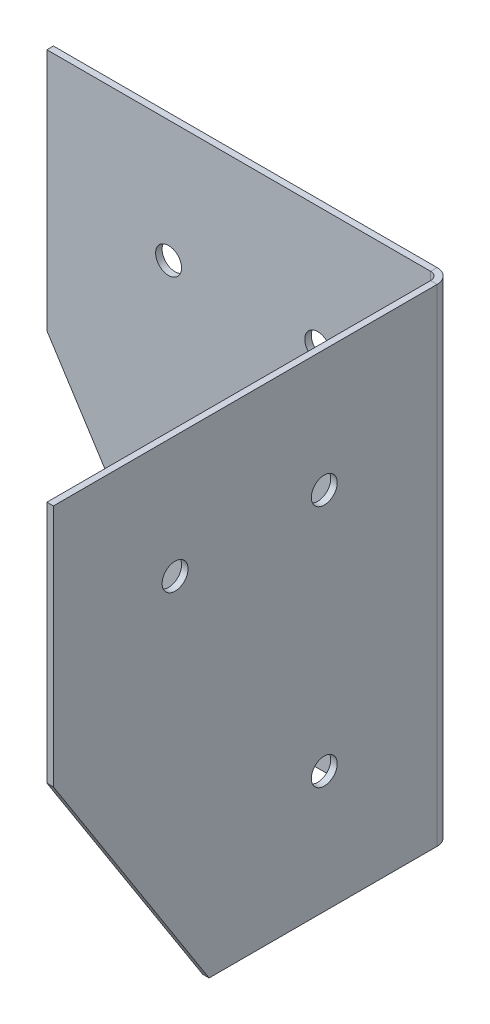
ISO-10303-21;
HEADER;
FILE_DESCRIPTION(('STEP AP214'),'2;1');
FILE_NAME('part.step','',(''),(''),'','','');
FILE_SCHEMA(('AUTOMOTIVE_DESIGN { 1 0 10303 214 1 1 1 1 }'));
ENDSEC;
DATA;
#1=APPLICATION_CONTEXT('core data for automotive mechanical design processes');
#2=APPLICATION_PROTOCOL_DEFINITION('international standard','automotive_design',2000,#1);
#3=PRODUCT_CONTEXT('',#1,'mechanical');
#4=PRODUCT('Part','Part','',(#3));
#5=PRODUCT_RELATED_PRODUCT_CATEGORY('part','',(#4));
#6=PRODUCT_DEFINITION_FORMATION('','',#4);
#7=PRODUCT_DEFINITION_CONTEXT('part definition',#1,'design');
#8=PRODUCT_DEFINITION('design','',#6,#7);
#9=PRODUCT_DEFINITION_SHAPE('','',#8);
#10=(LENGTH_UNIT() NAMED_UNIT(*) SI_UNIT(.MILLI.,.METRE.));
#11=(NAMED_UNIT(*) PLANE_ANGLE_UNIT() SI_UNIT($,.RADIAN.));
#12=(NAMED_UNIT(*) SI_UNIT($,.STERADIAN.) SOLID_ANGLE_UNIT());
#13=UNCERTAINTY_MEASURE_WITH_UNIT(LENGTH_MEASURE(1.E-05),#10,'distance_accuracy_value','');
#14=(GEOMETRIC_REPRESENTATION_CONTEXT(3) GLOBAL_UNCERTAINTY_ASSIGNED_CONTEXT((#13)) GLOBAL_UNIT_ASSIGNED_CONTEXT((#10,
#11,#12)) REPRESENTATION_CONTEXT('',''));
#15=CARTESIAN_POINT('',(0.,0.,0.));
#16=DIRECTION('',(0.,0.,1.));
#17=DIRECTION('',(1.,0.,0.));
#18=AXIS2_PLACEMENT_3D('',#15,#16,#17);
#19=CARTESIAN_POINT('',(-0.0995574287564259,0.,-0.0995574287564274));
#20=DIRECTION('',(1.,0.,0.));
#21=DIRECTION('',(0.,0.,-1.));
#22=AXIS2_PLACEMENT_3D('',#19,#20,#21);
#23=PLANE('',#22);
#24=CARTESIAN_POINT('',(-0.0995574287564783,-13.5,14.9104160059651));
#25=DIRECTION('',(-1.,0.,0.));
#26=DIRECTION('',(0.,0.,-1.));
#27=AXIS2_PLACEMENT_3D('',#24,#25,#26);
#28=CIRCLE('',#27,1.6);
#29=CARTESIAN_POINT('',(-0.0995574287564727,-13.5,13.3104160059651));
#30=VERTEX_POINT('',#29);
#31=EDGE_CURVE('E204',#30,#30,#28,.T.);
#32=ORIENTED_EDGE('',*,*,#31,.F.);
#33=EDGE_LOOP('',(#32));
#34=FACE_BOUND('',#33,.T.);
#35=CARTESIAN_POINT('',(-0.0995574287564783,16.5,14.9104160059651));
#36=DIRECTION('',(-1.,0.,0.));
#37=DIRECTION('',(0.,0.,-1.));
#38=AXIS2_PLACEMENT_3D('',#35,#36,#37);
#39=CIRCLE('',#38,1.6);
#40=CARTESIAN_POINT('',(-0.0995574287564727,16.5,13.3104160059651));
#41=VERTEX_POINT('',#40);
#42=EDGE_CURVE('E196',#41,#41,#39,.T.);
#43=ORIENTED_EDGE('',*,*,#42,.F.);
#44=EDGE_LOOP('',(#43));
#45=FACE_BOUND('',#44,.T.);
#46=CARTESIAN_POINT('',(-0.0995574287565425,16.5,33.3004425712436));
#47=DIRECTION('',(-1.,0.,0.));
#48=DIRECTION('',(0.,0.,-1.));
#49=AXIS2_PLACEMENT_3D('',#46,#47,#48);
#50=CIRCLE('',#49,1.6);
#51=CARTESIAN_POINT('',(-0.0995574287565369,16.5,31.7004425712436));
#52=VERTEX_POINT('',#51);
#53=EDGE_CURVE('E197',#52,#52,#50,.T.);
#54=ORIENTED_EDGE('',*,*,#53,.F.);
#55=EDGE_LOOP('',(#54));
#56=FACE_BOUND('',#55,.T.);
#57=DIRECTION('',(0.,0.,-1.));
#58=VECTOR('',#57,1.);
#59=CARTESIAN_POINT('',(-0.0995574287562569,31.5,-48.4995574287564));
#60=LINE('',#59,#58);
#61=CARTESIAN_POINT('',(-0.0995574287565949,31.5,48.3004425712436));
#62=VERTEX_POINT('',#61);
#63=CARTESIAN_POINT('',(-0.0995574287564297,31.5,1.));
#64=VERTEX_POINT('',#63);
#65=EDGE_CURVE('E63',#62,#64,#60,.T.);
#66=ORIENTED_EDGE('',*,*,#65,.T.);
#67=DIRECTION('',(0.,-1.,0.));
#68=VECTOR('',#67,1.);
#69=CARTESIAN_POINT('',(-0.0995574287564297,0.,1.));
#70=LINE('',#69,#68);
#71=CARTESIAN_POINT('',(-0.0995574287564297,-28.5,1.));
#72=VERTEX_POINT('',#71);
#73=EDGE_CURVE('E55',#64,#72,#70,.T.);
#74=ORIENTED_EDGE('',*,*,#73,.T.);
#75=DIRECTION('',(0.,0.,1.));
#76=VECTOR('',#75,1.);
#77=CARTESIAN_POINT('',(-0.0995574287565278,-28.5,29.1004425712436));
#78=LINE('',#77,#76);
#79=CARTESIAN_POINT('',(-0.0995574287565278,-28.5,29.1004425712436));
#80=VERTEX_POINT('',#79);
#81=EDGE_CURVE('E71',#72,#80,#78,.T.);
#82=ORIENTED_EDGE('',*,*,#81,.T.);
#83=DIRECTION('',(0.,0.842271400661511,0.539053696423368));
#84=VECTOR('',#83,1.);
#85=CARTESIAN_POINT('',(-0.0995574287565278,-28.5,29.1004425712436));
#86=LINE('',#85,#84);
#87=CARTESIAN_POINT('',(-0.0995574287565949,1.49999999999999,48.3004425712436));
#88=VERTEX_POINT('',#87);
#89=EDGE_CURVE('E219',#80,#88,#86,.T.);
#90=ORIENTED_EDGE('',*,*,#89,.T.);
#91=DIRECTION('',(0.,1.,0.));
#92=VECTOR('',#91,1.);
#93=CARTESIAN_POINT('',(-0.0995574287565949,1.49999999999999,48.3004425712436));
#94=LINE('',#93,#92);
#95=EDGE_CURVE('E222',#88,#62,#94,.T.);
#96=ORIENTED_EDGE('',*,*,#95,.T.);
#97=EDGE_LOOP('',(#66,#74,#82,#90,#96));
#98=FACE_BOUND('',#97,.T.);
#99=ADVANCED_FACE('F46',(#34,#45,#56,#98),#23,.F.);
#100=CARTESIAN_POINT('',(0.700442571243743,31.5,-48.4995574287564));
#101=DIRECTION('',(0.,1.,0.));
#102=DIRECTION('',(-1.,0.,0.));
#103=AXIS2_PLACEMENT_3D('',#100,#101,#102);
#104=PLANE('',#103);
#105=DIRECTION('',(1.,0.,0.));
#106=VECTOR('',#105,1.);
#107=CARTESIAN_POINT('',(0.70044257124357,31.5,1.));
#108=LINE('',#107,#106);
#109=CARTESIAN_POINT('',(0.70044257124357,31.5,1.));
#110=VERTEX_POINT('',#109);
#111=EDGE_CURVE('E12',#64,#110,#108,.T.);
#112=ORIENTED_EDGE('',*,*,#111,.F.);
#113=ORIENTED_EDGE('',*,*,#65,.F.);
#114=DIRECTION('',(-1.,0.,0.));
#115=VECTOR('',#114,1.);
#116=CARTESIAN_POINT('',(0.700442571243405,31.5,48.3004425712436));
#117=LINE('',#116,#115);
#118=CARTESIAN_POINT('',(0.700442571243405,31.5,48.3004425712436));
#119=VERTEX_POINT('',#118);
#120=EDGE_CURVE('E224',#119,#62,#117,.T.);
#121=ORIENTED_EDGE('',*,*,#120,.F.);
#122=DIRECTION('',(0.,0.,-1.));
#123=VECTOR('',#122,1.);
#124=CARTESIAN_POINT('',(0.700442571243743,31.5,-48.4995574287564));
#125=LINE('',#124,#123);
#126=EDGE_CURVE('E218',#119,#110,#125,.T.);
#127=ORIENTED_EDGE('',*,*,#126,.T.);
#128=EDGE_LOOP('',(#112,#113,#121,#127));
#129=FACE_BOUND('',#128,.T.);
#130=ADVANCED_FACE('F48',(#129),#104,.T.);
#131=CARTESIAN_POINT('',(0.700442571243405,1.49999999999999,48.3004425712436));
#132=DIRECTION('',(0.,0.,1.));
#133=DIRECTION('',(1.,0.,0.));
#134=AXIS2_PLACEMENT_3D('',#131,#132,#133);
#135=PLANE('',#134);
#136=ORIENTED_EDGE('',*,*,#95,.F.);
#137=DIRECTION('',(-1.,0.,0.));
#138=VECTOR('',#137,1.);
#139=CARTESIAN_POINT('',(0.700442571243405,1.49999999999999,48.3004425712436));
#140=LINE('',#139,#138);
#141=CARTESIAN_POINT('',(0.700442571243405,1.49999999999999,48.3004425712436));
#142=VERTEX_POINT('',#141);
#143=EDGE_CURVE('E226',#142,#88,#140,.T.);
#144=ORIENTED_EDGE('',*,*,#143,.F.);
#145=DIRECTION('',(0.,1.,0.));
#146=VECTOR('',#145,1.);
#147=CARTESIAN_POINT('',(0.700442571243405,1.49999999999999,48.3004425712436));
#148=LINE('',#147,#146);
#149=EDGE_CURVE('E215',#142,#119,#148,.T.);
#150=ORIENTED_EDGE('',*,*,#149,.T.);
#151=ORIENTED_EDGE('',*,*,#120,.T.);
#152=EDGE_LOOP('',(#136,#144,#150,#151));
#153=FACE_BOUND('',#152,.T.);
#154=ADVANCED_FACE('F250',(#153),#135,.T.);
#155=CARTESIAN_POINT('',(0.700442571243472,-28.5,29.1004425712436));
#156=DIRECTION('',(0.,-0.539053696423368,0.842271400661511));
#157=DIRECTION('',(0.,0.842271400661511,0.539053696423368));
#158=AXIS2_PLACEMENT_3D('',#155,#156,#157);
#159=PLANE('',#158);
#160=ORIENTED_EDGE('',*,*,#89,.F.);
#161=DIRECTION('',(-1.,0.,0.));
#162=VECTOR('',#161,1.);
#163=CARTESIAN_POINT('',(0.700442571243472,-28.5,29.1004425712436));
#164=LINE('',#163,#162);
#165=CARTESIAN_POINT('',(0.700442571243472,-28.5,29.1004425712436));
#166=VERTEX_POINT('',#165);
#167=EDGE_CURVE('E228',#166,#80,#164,.T.);
#168=ORIENTED_EDGE('',*,*,#167,.F.);
#169=DIRECTION('',(0.,0.842271400661511,0.539053696423368));
#170=VECTOR('',#169,1.);
#171=CARTESIAN_POINT('',(0.700442571243472,-28.5,29.1004425712436));
#172=LINE('',#171,#170);
#173=EDGE_CURVE('E212',#166,#142,#172,.T.);
#174=ORIENTED_EDGE('',*,*,#173,.T.);
#175=ORIENTED_EDGE('',*,*,#143,.T.);
#176=EDGE_LOOP('',(#160,#168,#174,#175));
#177=FACE_BOUND('',#176,.T.);
#178=ADVANCED_FACE('F243',(#177),#159,.T.);
#179=CARTESIAN_POINT('',(0.700442571243472,-28.5,29.1004425712436));
#180=DIRECTION('',(0.,-1.,0.));
#181=DIRECTION('',(1.,0.,0.));
#182=AXIS2_PLACEMENT_3D('',#179,#180,#181);
#183=PLANE('',#182);
#184=DIRECTION('',(-1.,0.,0.));
#185=VECTOR('',#184,1.);
#186=CARTESIAN_POINT('',(0.70044257124357,-28.5,1.00000000000001));
#187=LINE('',#186,#185);
#188=CARTESIAN_POINT('',(0.70044257124357,-28.5,1.00000000000001));
#189=VERTEX_POINT('',#188);
#190=EDGE_CURVE('E231',#189,#72,#187,.T.);
#191=ORIENTED_EDGE('',*,*,#190,.F.);
#192=DIRECTION('',(0.,0.,1.));
#193=VECTOR('',#192,1.);
#194=CARTESIAN_POINT('',(0.700442571243472,-28.5,29.1004425712436));
#195=LINE('',#194,#193);
#196=EDGE_CURVE('E50',#189,#166,#195,.T.);
#197=ORIENTED_EDGE('',*,*,#196,.T.);
#198=ORIENTED_EDGE('',*,*,#167,.T.);
#199=ORIENTED_EDGE('',*,*,#81,.F.);
#200=EDGE_LOOP('',(#191,#197,#198,#199));
#201=FACE_BOUND('',#200,.T.);
#202=ADVANCED_FACE('F238',(#201),#183,.T.);
#203=CARTESIAN_POINT('',(0.700442571243574,0.,-0.0995574287564246));
#204=DIRECTION('',(1.,0.,0.));
#205=DIRECTION('',(0.,0.,-1.));
#206=AXIS2_PLACEMENT_3D('',#203,#204,#205);
#207=PLANE('',#206);
#208=DIRECTION('',(0.,-1.,0.));
#209=VECTOR('',#208,1.);
#210=CARTESIAN_POINT('',(0.70044257124357,0.,1.00000000000001));
#211=LINE('',#210,#209);
#212=EDGE_CURVE('E147',#110,#189,#211,.T.);
#213=ORIENTED_EDGE('',*,*,#212,.F.);
#214=ORIENTED_EDGE('',*,*,#126,.F.);
#215=ORIENTED_EDGE('',*,*,#149,.F.);
#216=ORIENTED_EDGE('',*,*,#173,.F.);
#217=ORIENTED_EDGE('',*,*,#196,.F.);
#218=EDGE_LOOP('',(#213,#214,#215,#216,#217));
#219=FACE_BOUND('',#218,.T.);
#220=CARTESIAN_POINT('',(0.700442571243458,16.5,33.3004425712436));
#221=DIRECTION('',(-1.,0.,0.));
#222=DIRECTION('',(0.,0.,-1.));
#223=AXIS2_PLACEMENT_3D('',#220,#221,#222);
#224=CIRCLE('',#223,1.6);
#225=CARTESIAN_POINT('',(0.700442571243463,16.5,31.7004425712436));
#226=VERTEX_POINT('',#225);
#227=EDGE_CURVE('E193',#226,#226,#224,.T.);
#228=ORIENTED_EDGE('',*,*,#227,.T.);
#229=EDGE_LOOP('',(#228));
#230=FACE_BOUND('',#229,.T.);
#231=CARTESIAN_POINT('',(0.700442571243522,16.5,14.9104160059651));
#232=DIRECTION('',(-1.,0.,0.));
#233=DIRECTION('',(0.,0.,-1.));
#234=AXIS2_PLACEMENT_3D('',#231,#232,#233);
#235=CIRCLE('',#234,1.6);
#236=CARTESIAN_POINT('',(0.700442571243527,16.5,13.3104160059651));
#237=VERTEX_POINT('',#236);
#238=EDGE_CURVE('E201',#237,#237,#235,.T.);
#239=ORIENTED_EDGE('',*,*,#238,.T.);
#240=EDGE_LOOP('',(#239));
#241=FACE_BOUND('',#240,.T.);
#242=CARTESIAN_POINT('',(0.700442571243522,-13.5,14.9104160059651));
#243=DIRECTION('',(-1.,0.,0.));
#244=DIRECTION('',(0.,0.,-1.));
#245=AXIS2_PLACEMENT_3D('',#242,#243,#244);
#246=CIRCLE('',#245,1.6);
#247=CARTESIAN_POINT('',(0.700442571243527,-13.5,13.3104160059651));
#248=VERTEX_POINT('',#247);
#249=EDGE_CURVE('E207',#248,#248,#246,.T.);
#250=ORIENTED_EDGE('',*,*,#249,.T.);
#251=EDGE_LOOP('',(#250));
#252=FACE_BOUND('',#251,.T.);
#253=ADVANCED_FACE('F245',(#219,#230,#241,#252),#207,.T.);
#254=CARTESIAN_POINT('',(0.700442571243522,-13.5,14.9104160059651));
#255=DIRECTION('',(-1.,0.,0.));
#256=DIRECTION('',(0.,0.,1.));
#257=AXIS2_PLACEMENT_3D('',#254,#255,#256);
#258=CYLINDRICAL_SURFACE('',#257,1.6);
#259=ORIENTED_EDGE('',*,*,#249,.F.);
#260=EDGE_LOOP('',(#259));
#261=FACE_BOUND('',#260,.T.);
#262=ORIENTED_EDGE('',*,*,#31,.T.);
#263=EDGE_LOOP('',(#262));
#264=FACE_BOUND('',#263,.T.);
#265=ADVANCED_FACE('F313',(#261,#264),#258,.F.);
#266=CARTESIAN_POINT('',(0.700442571243522,16.5,14.9104160059651));
#267=DIRECTION('',(-1.,0.,0.));
#268=DIRECTION('',(0.,0.,1.));
#269=AXIS2_PLACEMENT_3D('',#266,#267,#268);
#270=CYLINDRICAL_SURFACE('',#269,1.6);
#271=ORIENTED_EDGE('',*,*,#238,.F.);
#272=EDGE_LOOP('',(#271));
#273=FACE_BOUND('',#272,.T.);
#274=ORIENTED_EDGE('',*,*,#42,.T.);
#275=EDGE_LOOP('',(#274));
#276=FACE_BOUND('',#275,.T.);
#277=ADVANCED_FACE('F320',(#273,#276),#270,.F.);
#278=CARTESIAN_POINT('',(0.700442571243458,16.5,33.3004425712436));
#279=DIRECTION('',(-1.,0.,0.));
#280=DIRECTION('',(0.,0.,1.));
#281=AXIS2_PLACEMENT_3D('',#278,#279,#280);
#282=CYLINDRICAL_SURFACE('',#281,1.6);
#283=ORIENTED_EDGE('',*,*,#227,.F.);
#284=EDGE_LOOP('',(#283));
#285=FACE_BOUND('',#284,.T.);
#286=ORIENTED_EDGE('',*,*,#53,.T.);
#287=EDGE_LOOP('',(#286));
#288=FACE_BOUND('',#287,.T.);
#289=ADVANCED_FACE('F298',(#285,#288),#282,.F.);
#290=CARTESIAN_POINT('',(-48.4,1.49999999999999,-0.8));
#291=DIRECTION('',(-1.,0.,0.));
#292=DIRECTION('',(0.,0.,1.));
#293=AXIS2_PLACEMENT_3D('',#290,#291,#292);
#294=PLANE('',#293);
#295=DIRECTION('',(0.,-1.,0.));
#296=VECTOR('',#295,1.);
#297=CARTESIAN_POINT('',(-48.4,1.49999999999999,0.));
#298=LINE('',#297,#296);
#299=CARTESIAN_POINT('',(-48.4,31.5,0.));
#300=VERTEX_POINT('',#299);
#301=CARTESIAN_POINT('',(-48.4,1.49999999999999,0.));
#302=VERTEX_POINT('',#301);
#303=EDGE_CURVE('E273',#300,#302,#298,.T.);
#304=ORIENTED_EDGE('',*,*,#303,.F.);
#305=DIRECTION('',(0.,0.,1.));
#306=VECTOR('',#305,1.);
#307=CARTESIAN_POINT('',(-48.4,31.5,-0.8));
#308=LINE('',#307,#306);
#309=CARTESIAN_POINT('',(-48.4,31.5,-0.8));
#310=VERTEX_POINT('',#309);
#311=EDGE_CURVE('E200',#310,#300,#308,.T.);
#312=ORIENTED_EDGE('',*,*,#311,.F.);
#313=DIRECTION('',(0.,-1.,0.));
#314=VECTOR('',#313,1.);
#315=CARTESIAN_POINT('',(-48.4,1.49999999999999,-0.8));
#316=LINE('',#315,#314);
#317=CARTESIAN_POINT('',(-48.4,1.49999999999999,-0.8));
#318=VERTEX_POINT('',#317);
#319=EDGE_CURVE('E189',#310,#318,#316,.T.);
#320=ORIENTED_EDGE('',*,*,#319,.T.);
#321=DIRECTION('',(0.,0.,1.));
#322=VECTOR('',#321,1.);
#323=CARTESIAN_POINT('',(-48.4,1.49999999999999,-0.8));
#324=LINE('',#323,#322);
#325=EDGE_CURVE('E187',#318,#302,#324,.T.);
#326=ORIENTED_EDGE('',*,*,#325,.T.);
#327=EDGE_LOOP('',(#304,#312,#320,#326));
#328=FACE_BOUND('',#327,.T.);
#329=ADVANCED_FACE('F284',(#328),#294,.T.);
#330=CARTESIAN_POINT('',(-29.2,-28.5,-0.8));
#331=DIRECTION('',(-0.842271400661511,-0.539053696423368,0.));
#332=DIRECTION('',(0.539053696423368,-0.842271400661511,0.));
#333=AXIS2_PLACEMENT_3D('',#330,#331,#332);
#334=PLANE('',#333);
#335=DIRECTION('',(0.539053696423368,-0.842271400661511,0.));
#336=VECTOR('',#335,1.);
#337=CARTESIAN_POINT('',(-29.2,-28.5,0.));
#338=LINE('',#337,#336);
#339=CARTESIAN_POINT('',(-29.2,-28.5,0.));
#340=VERTEX_POINT('',#339);
#341=EDGE_CURVE('E270',#302,#340,#338,.T.);
#342=ORIENTED_EDGE('',*,*,#341,.F.);
#343=ORIENTED_EDGE('',*,*,#325,.F.);
#344=DIRECTION('',(0.539053696423368,-0.842271400661511,0.));
#345=VECTOR('',#344,1.);
#346=CARTESIAN_POINT('',(-29.2,-28.5,-0.8));
#347=LINE('',#346,#345);
#348=CARTESIAN_POINT('',(-29.2,-28.5,-0.8));
#349=VERTEX_POINT('',#348);
#350=EDGE_CURVE('E185',#318,#349,#347,.T.);
#351=ORIENTED_EDGE('',*,*,#350,.T.);
#352=DIRECTION('',(0.,0.,1.));
#353=VECTOR('',#352,1.);
#354=CARTESIAN_POINT('',(-29.2,-28.5,-0.8));
#355=LINE('',#354,#353);
#356=EDGE_CURVE('E163',#349,#340,#355,.T.);
#357=ORIENTED_EDGE('',*,*,#356,.T.);
#358=EDGE_LOOP('',(#342,#343,#351,#357));
#359=FACE_BOUND('',#358,.T.);
#360=ADVANCED_FACE('F287',(#359),#334,.T.);
#361=CARTESIAN_POINT('',(-15.0099734347215,-13.5,-0.8));
#362=DIRECTION('',(0.,0.,1.));
#363=DIRECTION('',(1.,0.,0.));
#364=AXIS2_PLACEMENT_3D('',#361,#362,#363);
#365=CYLINDRICAL_SURFACE('',#364,1.6);
#366=CARTESIAN_POINT('',(-15.0099734347215,-13.5,-0.8));
#367=DIRECTION('',(0.,0.,1.));
#368=DIRECTION('',(1.,0.,0.));
#369=AXIS2_PLACEMENT_3D('',#366,#367,#368);
#370=CIRCLE('',#369,1.6);
#371=CARTESIAN_POINT('',(-13.4099734347215,-13.5,-0.8));
#372=VERTEX_POINT('',#371);
#373=EDGE_CURVE('E160',#372,#372,#370,.T.);
#374=ORIENTED_EDGE('',*,*,#373,.F.);
#375=EDGE_LOOP('',(#374));
#376=FACE_BOUND('',#375,.T.);
#377=CARTESIAN_POINT('',(-15.0099734347215,-13.5,0.));
#378=DIRECTION('',(0.,0.,1.));
#379=DIRECTION('',(1.,0.,0.));
#380=AXIS2_PLACEMENT_3D('',#377,#378,#379);
#381=CIRCLE('',#380,1.6);
#382=CARTESIAN_POINT('',(-13.4099734347215,-13.5,0.));
#383=VERTEX_POINT('',#382);
#384=EDGE_CURVE('E181',#383,#383,#381,.T.);
#385=ORIENTED_EDGE('',*,*,#384,.T.);
#386=EDGE_LOOP('',(#385));
#387=FACE_BOUND('',#386,.T.);
#388=ADVANCED_FACE('F289',(#376,#387),#365,.F.);
#389=CARTESIAN_POINT('',(-15.0099734347215,16.5,-0.8));
#390=DIRECTION('',(0.,0.,1.));
#391=DIRECTION('',(1.,0.,0.));
#392=AXIS2_PLACEMENT_3D('',#389,#390,#391);
#393=CYLINDRICAL_SURFACE('',#392,1.6);
#394=CARTESIAN_POINT('',(-15.0099734347215,16.5,-0.8));
#395=DIRECTION('',(0.,0.,1.));
#396=DIRECTION('',(1.,0.,0.));
#397=AXIS2_PLACEMENT_3D('',#394,#395,#396);
#398=CIRCLE('',#397,1.6);
#399=CARTESIAN_POINT('',(-13.4099734347215,16.5,-0.8));
#400=VERTEX_POINT('',#399);
#401=EDGE_CURVE('E169',#400,#400,#398,.T.);
#402=ORIENTED_EDGE('',*,*,#401,.F.);
#403=EDGE_LOOP('',(#402));
#404=FACE_BOUND('',#403,.T.);
#405=CARTESIAN_POINT('',(-15.0099734347215,16.5,0.));
#406=DIRECTION('',(0.,0.,1.));
#407=DIRECTION('',(1.,0.,0.));
#408=AXIS2_PLACEMENT_3D('',#405,#406,#407);
#409=CIRCLE('',#408,1.6);
#410=CARTESIAN_POINT('',(-13.4099734347215,16.5,0.));
#411=VERTEX_POINT('',#410);
#412=EDGE_CURVE('E178',#411,#411,#409,.T.);
#413=ORIENTED_EDGE('',*,*,#412,.T.);
#414=EDGE_LOOP('',(#413));
#415=FACE_BOUND('',#414,.T.);
#416=ADVANCED_FACE('F295',(#404,#415),#393,.F.);
#417=CARTESIAN_POINT('',(-33.4,16.5,-0.8));
#418=DIRECTION('',(0.,0.,1.));
#419=DIRECTION('',(1.,0.,0.));
#420=AXIS2_PLACEMENT_3D('',#417,#418,#419);
#421=CYLINDRICAL_SURFACE('',#420,1.6);
#422=CARTESIAN_POINT('',(-33.4,16.5,-0.8));
#423=DIRECTION('',(0.,0.,1.));
#424=DIRECTION('',(1.,0.,0.));
#425=AXIS2_PLACEMENT_3D('',#422,#423,#424);
#426=CIRCLE('',#425,1.6);
#427=CARTESIAN_POINT('',(-31.8,16.5,-0.8));
#428=VERTEX_POINT('',#427);
#429=EDGE_CURVE('E172',#428,#428,#426,.T.);
#430=ORIENTED_EDGE('',*,*,#429,.F.);
#431=EDGE_LOOP('',(#430));
#432=FACE_BOUND('',#431,.T.);
#433=CARTESIAN_POINT('',(-33.4,16.5,0.));
#434=DIRECTION('',(0.,0.,1.));
#435=DIRECTION('',(1.,0.,0.));
#436=AXIS2_PLACEMENT_3D('',#433,#434,#435);
#437=CIRCLE('',#436,1.6);
#438=CARTESIAN_POINT('',(-31.8,16.5,0.));
#439=VERTEX_POINT('',#438);
#440=EDGE_CURVE('E175',#439,#439,#437,.T.);
#441=ORIENTED_EDGE('',*,*,#440,.T.);
#442=EDGE_LOOP('',(#441));
#443=FACE_BOUND('',#442,.T.);
#444=ADVANCED_FACE('F337',(#432,#443),#421,.F.);
#445=CARTESIAN_POINT('',(0.,0.,-0.8));
#446=DIRECTION('',(0.,0.,-1.));
#447=DIRECTION('',(-1.,0.,0.));
#448=AXIS2_PLACEMENT_3D('',#445,#446,#447);
#449=PLANE('',#448);
#450=ORIENTED_EDGE('',*,*,#429,.T.);
#451=EDGE_LOOP('',(#450));
#452=FACE_BOUND('',#451,.T.);
#453=ORIENTED_EDGE('',*,*,#401,.T.);
#454=EDGE_LOOP('',(#453));
#455=FACE_BOUND('',#454,.T.);
#456=ORIENTED_EDGE('',*,*,#373,.T.);
#457=EDGE_LOOP('',(#456));
#458=FACE_BOUND('',#457,.T.);
#459=DIRECTION('',(-1.,0.,0.));
#460=VECTOR('',#459,1.);
#461=CARTESIAN_POINT('',(-48.4,31.5,-0.8));
#462=LINE('',#461,#460);
#463=CARTESIAN_POINT('',(-1.09955742875643,31.5,-0.8));
#464=VERTEX_POINT('',#463);
#465=EDGE_CURVE('E158',#464,#310,#462,.T.);
#466=ORIENTED_EDGE('',*,*,#465,.F.);
#467=DIRECTION('',(0.,-1.,0.));
#468=VECTOR('',#467,1.);
#469=CARTESIAN_POINT('',(-1.09955742875643,0.,-0.8));
#470=LINE('',#469,#468);
#471=CARTESIAN_POINT('',(-1.09955742875643,-28.5,-0.8));
#472=VERTEX_POINT('',#471);
#473=EDGE_CURVE('E145',#464,#472,#470,.T.);
#474=ORIENTED_EDGE('',*,*,#473,.T.);
#475=DIRECTION('',(1.,0.,0.));
#476=VECTOR('',#475,1.);
#477=CARTESIAN_POINT('',(29.2,-28.5,-0.8));
#478=LINE('',#477,#476);
#479=EDGE_CURVE('E138',#349,#472,#478,.T.);
#480=ORIENTED_EDGE('',*,*,#479,.F.);
#481=ORIENTED_EDGE('',*,*,#350,.F.);
#482=ORIENTED_EDGE('',*,*,#319,.F.);
#483=EDGE_LOOP('',(#466,#474,#480,#481,#482));
#484=FACE_BOUND('',#483,.T.);
#485=ADVANCED_FACE('F154',(#452,#455,#458,#484),#449,.T.);
#486=CARTESIAN_POINT('',(29.2,-28.5,-0.8));
#487=DIRECTION('',(0.,-1.,0.));
#488=DIRECTION('',(0.,0.,-1.));
#489=AXIS2_PLACEMENT_3D('',#486,#487,#488);
#490=PLANE('',#489);
#491=ORIENTED_EDGE('',*,*,#479,.T.);
#492=DIRECTION('',(0.,0.,1.));
#493=VECTOR('',#492,1.);
#494=CARTESIAN_POINT('',(-1.09955742875643,-28.5,-0.8));
#495=LINE('',#494,#493);
#496=CARTESIAN_POINT('',(-1.09955742875643,-28.5,0.));
#497=VERTEX_POINT('',#496);
#498=EDGE_CURVE('E126',#472,#497,#495,.T.);
#499=ORIENTED_EDGE('',*,*,#498,.T.);
#500=DIRECTION('',(1.,0.,0.));
#501=VECTOR('',#500,1.);
#502=CARTESIAN_POINT('',(29.2,-28.5,0.));
#503=LINE('',#502,#501);
#504=EDGE_CURVE('E268',#340,#497,#503,.T.);
#505=ORIENTED_EDGE('',*,*,#504,.F.);
#506=ORIENTED_EDGE('',*,*,#356,.F.);
#507=EDGE_LOOP('',(#491,#499,#505,#506));
#508=FACE_BOUND('',#507,.T.);
#509=ADVANCED_FACE('F162',(#508),#490,.T.);
#510=CARTESIAN_POINT('',(0.,0.,0.));
#511=DIRECTION('',(0.,0.,-1.));
#512=DIRECTION('',(-1.,0.,0.));
#513=AXIS2_PLACEMENT_3D('',#510,#511,#512);
#514=PLANE('',#513);
#515=DIRECTION('',(0.,-1.,0.));
#516=VECTOR('',#515,1.);
#517=CARTESIAN_POINT('',(-1.09955742875643,0.,0.));
#518=LINE('',#517,#516);
#519=CARTESIAN_POINT('',(-1.09955742875643,31.5,0.));
#520=VERTEX_POINT('',#519);
#521=EDGE_CURVE('E148',#520,#497,#518,.T.);
#522=ORIENTED_EDGE('',*,*,#521,.F.);
#523=DIRECTION('',(-1.,0.,0.));
#524=VECTOR('',#523,1.);
#525=CARTESIAN_POINT('',(-48.4,31.5,0.));
#526=LINE('',#525,#524);
#527=EDGE_CURVE('E137',#520,#300,#526,.T.);
#528=ORIENTED_EDGE('',*,*,#527,.T.);
#529=ORIENTED_EDGE('',*,*,#303,.T.);
#530=ORIENTED_EDGE('',*,*,#341,.T.);
#531=ORIENTED_EDGE('',*,*,#504,.T.);
#532=EDGE_LOOP('',(#522,#528,#529,#530,#531));
#533=FACE_BOUND('',#532,.T.);
#534=ORIENTED_EDGE('',*,*,#384,.F.);
#535=EDGE_LOOP('',(#534));
#536=FACE_BOUND('',#535,.T.);
#537=ORIENTED_EDGE('',*,*,#412,.F.);
#538=EDGE_LOOP('',(#537));
#539=FACE_BOUND('',#538,.T.);
#540=ORIENTED_EDGE('',*,*,#440,.F.);
#541=EDGE_LOOP('',(#540));
#542=FACE_BOUND('',#541,.T.);
#543=ADVANCED_FACE('F277',(#533,#536,#539,#542),#514,.F.);
#544=CARTESIAN_POINT('',(-48.4,31.5,-0.8));
#545=DIRECTION('',(0.,1.,0.));
#546=DIRECTION('',(0.,0.,1.));
#547=AXIS2_PLACEMENT_3D('',#544,#545,#546);
#548=PLANE('',#547);
#549=ORIENTED_EDGE('',*,*,#527,.F.);
#550=DIRECTION('',(0.,0.,-1.));
#551=VECTOR('',#550,1.);
#552=CARTESIAN_POINT('',(-1.09955742875643,31.5,-0.8));
#553=LINE('',#552,#551);
#554=EDGE_CURVE('E266',#520,#464,#553,.T.);
#555=ORIENTED_EDGE('',*,*,#554,.T.);
#556=ORIENTED_EDGE('',*,*,#465,.T.);
#557=ORIENTED_EDGE('',*,*,#311,.T.);
#558=EDGE_LOOP('',(#549,#555,#556,#557));
#559=FACE_BOUND('',#558,.T.);
#560=ADVANCED_FACE('F282',(#559),#548,.T.);
#561=CARTESIAN_POINT('',(-1.09955742875643,31.5,1.));
#562=DIRECTION('',(0.,1.,0.));
#563=DIRECTION('',(0.,0.,1.));
#564=AXIS2_PLACEMENT_3D('',#561,#562,#563);
#565=PLANE('',#564);
#566=ORIENTED_EDGE('',*,*,#554,.F.);
#567=CARTESIAN_POINT('',(-1.09955742875643,31.5,1.));
#568=DIRECTION('',(0.,-1.,0.));
#569=DIRECTION('',(0.,0.,-1.));
#570=AXIS2_PLACEMENT_3D('',#567,#568,#569);
#571=CIRCLE('',#570,1.);
#572=EDGE_CURVE('E258',#520,#64,#571,.T.);
#573=ORIENTED_EDGE('',*,*,#572,.T.);
#574=ORIENTED_EDGE('',*,*,#111,.T.);
#575=CARTESIAN_POINT('',(-1.09955742875643,31.5,1.));
#576=DIRECTION('',(0.,-1.,0.));
#577=DIRECTION('',(0.,0.,1.));
#578=AXIS2_PLACEMENT_3D('',#575,#576,#577);
#579=CIRCLE('',#578,1.8);
#580=EDGE_CURVE('E149',#464,#110,#579,.T.);
#581=ORIENTED_EDGE('',*,*,#580,.F.);
#582=EDGE_LOOP('',(#566,#573,#574,#581));
#583=FACE_BOUND('',#582,.T.);
#584=ADVANCED_FACE('F330',(#583),#565,.T.);
#585=CARTESIAN_POINT('',(-1.09955742875643,-28.5,1.));
#586=DIRECTION('',(0.,-1.,0.));
#587=DIRECTION('',(0.,0.,-1.));
#588=AXIS2_PLACEMENT_3D('',#585,#586,#587);
#589=PLANE('',#588);
#590=CARTESIAN_POINT('',(-1.09955742875643,-28.5,1.));
#591=DIRECTION('',(0.,-1.,0.));
#592=DIRECTION('',(0.,0.,-1.));
#593=AXIS2_PLACEMENT_3D('',#590,#591,#592);
#594=CIRCLE('',#593,1.);
#595=EDGE_CURVE('E132',#72,#497,#594,.F.);
#596=ORIENTED_EDGE('',*,*,#595,.T.);
#597=ORIENTED_EDGE('',*,*,#498,.F.);
#598=CARTESIAN_POINT('',(-1.09955742875643,-28.5,1.));
#599=DIRECTION('',(0.,1.,0.));
#600=DIRECTION('',(0.,0.,-1.));
#601=AXIS2_PLACEMENT_3D('',#598,#599,#600);
#602=CIRCLE('',#601,1.8);
#603=EDGE_CURVE('E130',#189,#472,#602,.T.);
#604=ORIENTED_EDGE('',*,*,#603,.F.);
#605=ORIENTED_EDGE('',*,*,#190,.T.);
#606=EDGE_LOOP('',(#596,#597,#604,#605));
#607=FACE_BOUND('',#606,.T.);
#608=ADVANCED_FACE('F128',(#607),#589,.T.);
#609=CARTESIAN_POINT('',(-1.09955742875643,61.5456168771421,1.));
#610=DIRECTION('',(0.,-1.,0.));
#611=DIRECTION('',(0.,0.,-1.));
#612=AXIS2_PLACEMENT_3D('',#609,#610,#611);
#613=CYLINDRICAL_SURFACE('',#612,1.8);
#614=ORIENTED_EDGE('',*,*,#212,.T.);
#615=ORIENTED_EDGE('',*,*,#603,.T.);
#616=ORIENTED_EDGE('',*,*,#473,.F.);
#617=ORIENTED_EDGE('',*,*,#580,.T.);
#618=EDGE_LOOP('',(#614,#615,#616,#617));
#619=FACE_BOUND('',#618,.T.);
#620=ADVANCED_FACE('F143',(#619),#613,.T.);
#621=CARTESIAN_POINT('',(-1.09955742875643,61.5456168771421,1.));
#622=DIRECTION('',(0.,-1.,0.));
#623=DIRECTION('',(0.,0.,-1.));
#624=AXIS2_PLACEMENT_3D('',#621,#622,#623);
#625=CYLINDRICAL_SURFACE('',#624,1.);
#626=ORIENTED_EDGE('',*,*,#73,.F.);
#627=ORIENTED_EDGE('',*,*,#572,.F.);
#628=ORIENTED_EDGE('',*,*,#521,.T.);
#629=ORIENTED_EDGE('',*,*,#595,.F.);
#630=EDGE_LOOP('',(#626,#627,#628,#629));
#631=FACE_BOUND('',#630,.T.);
#632=ADVANCED_FACE('F255',(#631),#625,.F.);
#633=CLOSED_SHELL('',(#99,#130,#154,#178,#202,#253,#265,#277,#289,#329,#360,#388,#416,#444,#485,
#509,#543,#560,#584,#608,#620,#632));
#634=MANIFOLD_SOLID_BREP('B2',#633);
#635=ADVANCED_BREP_SHAPE_REPRESENTATION('',(#18,#634),#14);
#636=SHAPE_DEFINITION_REPRESENTATION(#9,#635);
ENDSEC;
END-ISO-10303-21;
